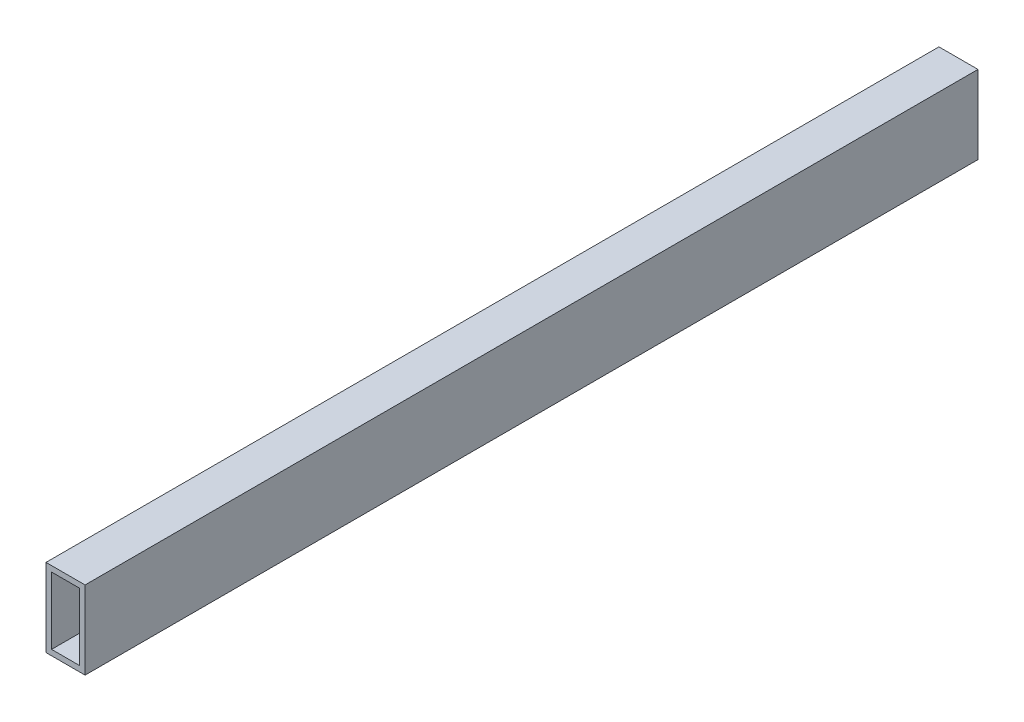
ISO-10303-21;
HEADER;
FILE_DESCRIPTION(('STEP AP214'),'2;1');
FILE_NAME('part.step','',(''),(''),'','','');
FILE_SCHEMA(('AUTOMOTIVE_DESIGN { 1 0 10303 214 1 1 1 1 }'));
ENDSEC;
DATA;
#1=APPLICATION_CONTEXT('core data for automotive mechanical design processes');
#2=APPLICATION_PROTOCOL_DEFINITION('international standard','automotive_design',2000,#1);
#3=PRODUCT_CONTEXT('',#1,'mechanical');
#4=PRODUCT('Part','Part','',(#3));
#5=PRODUCT_RELATED_PRODUCT_CATEGORY('part','',(#4));
#6=PRODUCT_DEFINITION_FORMATION('','',#4);
#7=PRODUCT_DEFINITION_CONTEXT('part definition',#1,'design');
#8=PRODUCT_DEFINITION('design','',#6,#7);
#9=PRODUCT_DEFINITION_SHAPE('','',#8);
#10=(LENGTH_UNIT() NAMED_UNIT(*) SI_UNIT(.MILLI.,.METRE.));
#11=(NAMED_UNIT(*) PLANE_ANGLE_UNIT() SI_UNIT($,.RADIAN.));
#12=(NAMED_UNIT(*) SI_UNIT($,.STERADIAN.) SOLID_ANGLE_UNIT());
#13=UNCERTAINTY_MEASURE_WITH_UNIT(LENGTH_MEASURE(1.E-05),#10,'distance_accuracy_value','');
#14=(GEOMETRIC_REPRESENTATION_CONTEXT(3) GLOBAL_UNCERTAINTY_ASSIGNED_CONTEXT((#13)) GLOBAL_UNIT_ASSIGNED_CONTEXT((#10,
#11,#12)) REPRESENTATION_CONTEXT('',''));
#15=CARTESIAN_POINT('',(0.,0.,0.));
#16=DIRECTION('',(0.,0.,1.));
#17=DIRECTION('',(1.,0.,0.));
#18=AXIS2_PLACEMENT_3D('',#15,#16,#17);
#19=CARTESIAN_POINT('',(0.,0.,160.));
#20=DIRECTION('',(0.,0.,1.));
#21=DIRECTION('',(1.,0.,0.));
#22=AXIS2_PLACEMENT_3D('',#19,#20,#21);
#23=PLANE('',#22);
#24=DIRECTION('',(0.,1.,0.));
#25=VECTOR('',#24,1.);
#26=CARTESIAN_POINT('',(0.,0.,160.));
#27=LINE('',#26,#25);
#28=CARTESIAN_POINT('',(0.,0.,160.));
#29=VERTEX_POINT('',#28);
#30=CARTESIAN_POINT('',(0.,14.,160.));
#31=VERTEX_POINT('',#30);
#32=EDGE_CURVE('E153',#29,#31,#27,.T.);
#33=ORIENTED_EDGE('',*,*,#32,.T.);
#34=DIRECTION('',(-1.,0.,0.));
#35=VECTOR('',#34,1.);
#36=CARTESIAN_POINT('',(0.,14.,160.));
#37=LINE('',#36,#35);
#38=CARTESIAN_POINT('',(-7.,14.,160.));
#39=VERTEX_POINT('',#38);
#40=EDGE_CURVE('E157',#31,#39,#37,.T.);
#41=ORIENTED_EDGE('',*,*,#40,.T.);
#42=DIRECTION('',(0.,-1.,0.));
#43=VECTOR('',#42,1.);
#44=CARTESIAN_POINT('',(-7.,14.,160.));
#45=LINE('',#44,#43);
#46=CARTESIAN_POINT('',(-7.,0.,160.));
#47=VERTEX_POINT('',#46);
#48=EDGE_CURVE('E161',#39,#47,#45,.T.);
#49=ORIENTED_EDGE('',*,*,#48,.T.);
#50=DIRECTION('',(1.,0.,0.));
#51=VECTOR('',#50,1.);
#52=CARTESIAN_POINT('',(0.,0.,160.));
#53=LINE('',#52,#51);
#54=EDGE_CURVE('E164',#47,#29,#53,.T.);
#55=ORIENTED_EDGE('',*,*,#54,.T.);
#56=EDGE_LOOP('',(#33,#41,#49,#55));
#57=FACE_BOUND('',#56,.T.);
#58=DIRECTION('',(-1.,0.,0.));
#59=VECTOR('',#58,1.);
#60=CARTESIAN_POINT('',(-6.,13.,160.));
#61=LINE('',#60,#59);
#62=CARTESIAN_POINT('',(-1.,13.,160.));
#63=VERTEX_POINT('',#62);
#64=CARTESIAN_POINT('',(-6.,13.,160.));
#65=VERTEX_POINT('',#64);
#66=EDGE_CURVE('E114',#63,#65,#61,.T.);
#67=ORIENTED_EDGE('',*,*,#66,.F.);
#68=DIRECTION('',(0.,1.,0.));
#69=VECTOR('',#68,1.);
#70=CARTESIAN_POINT('',(-1.,1.,160.));
#71=LINE('',#70,#69);
#72=CARTESIAN_POINT('',(-1.,1.,160.));
#73=VERTEX_POINT('',#72);
#74=EDGE_CURVE('E105',#73,#63,#71,.T.);
#75=ORIENTED_EDGE('',*,*,#74,.F.);
#76=DIRECTION('',(1.,0.,0.));
#77=VECTOR('',#76,1.);
#78=CARTESIAN_POINT('',(-6.,1.,160.));
#79=LINE('',#78,#77);
#80=CARTESIAN_POINT('',(-6.,1.,160.));
#81=VERTEX_POINT('',#80);
#82=EDGE_CURVE('E131',#81,#73,#79,.T.);
#83=ORIENTED_EDGE('',*,*,#82,.F.);
#84=DIRECTION('',(0.,-1.,0.));
#85=VECTOR('',#84,1.);
#86=CARTESIAN_POINT('',(-6.,1.,160.));
#87=LINE('',#86,#85);
#88=EDGE_CURVE('E127',#65,#81,#87,.T.);
#89=ORIENTED_EDGE('',*,*,#88,.F.);
#90=EDGE_LOOP('',(#67,#75,#83,#89));
#91=FACE_BOUND('',#90,.T.);
#92=ADVANCED_FACE('F39',(#57,#91),#23,.T.);
#93=CARTESIAN_POINT('',(0.,0.,0.));
#94=DIRECTION('',(0.,0.,1.));
#95=DIRECTION('',(1.,0.,0.));
#96=AXIS2_PLACEMENT_3D('',#93,#94,#95);
#97=PLANE('',#96);
#98=DIRECTION('',(0.,1.,0.));
#99=VECTOR('',#98,1.);
#100=CARTESIAN_POINT('',(0.,0.,0.));
#101=LINE('',#100,#99);
#102=CARTESIAN_POINT('',(0.,0.,0.));
#103=VERTEX_POINT('',#102);
#104=CARTESIAN_POINT('',(0.,14.,0.));
#105=VERTEX_POINT('',#104);
#106=EDGE_CURVE('E123',#103,#105,#101,.T.);
#107=ORIENTED_EDGE('',*,*,#106,.F.);
#108=DIRECTION('',(1.,0.,0.));
#109=VECTOR('',#108,1.);
#110=CARTESIAN_POINT('',(0.,0.,0.));
#111=LINE('',#110,#109);
#112=CARTESIAN_POINT('',(-7.,0.,0.));
#113=VERTEX_POINT('',#112);
#114=EDGE_CURVE('E158',#113,#103,#111,.T.);
#115=ORIENTED_EDGE('',*,*,#114,.F.);
#116=DIRECTION('',(0.,-1.,0.));
#117=VECTOR('',#116,1.);
#118=CARTESIAN_POINT('',(-7.,14.,0.));
#119=LINE('',#118,#117);
#120=CARTESIAN_POINT('',(-7.,14.,0.));
#121=VERTEX_POINT('',#120);
#122=EDGE_CURVE('E174',#121,#113,#119,.T.);
#123=ORIENTED_EDGE('',*,*,#122,.F.);
#124=DIRECTION('',(-1.,0.,0.));
#125=VECTOR('',#124,1.);
#126=CARTESIAN_POINT('',(0.,14.,0.));
#127=LINE('',#126,#125);
#128=EDGE_CURVE('E171',#105,#121,#127,.T.);
#129=ORIENTED_EDGE('',*,*,#128,.F.);
#130=EDGE_LOOP('',(#107,#115,#123,#129));
#131=FACE_BOUND('',#130,.T.);
#132=DIRECTION('',(0.,1.,0.));
#133=VECTOR('',#132,1.);
#134=CARTESIAN_POINT('',(-1.,1.,0.));
#135=LINE('',#134,#133);
#136=CARTESIAN_POINT('',(-1.,1.,0.));
#137=VERTEX_POINT('',#136);
#138=CARTESIAN_POINT('',(-1.,13.,0.));
#139=VERTEX_POINT('',#138);
#140=EDGE_CURVE('E63',#137,#139,#135,.T.);
#141=ORIENTED_EDGE('',*,*,#140,.T.);
#142=DIRECTION('',(-1.,0.,0.));
#143=VECTOR('',#142,1.);
#144=CARTESIAN_POINT('',(-6.,13.,0.));
#145=LINE('',#144,#143);
#146=CARTESIAN_POINT('',(-6.,13.,0.));
#147=VERTEX_POINT('',#146);
#148=EDGE_CURVE('E121',#139,#147,#145,.T.);
#149=ORIENTED_EDGE('',*,*,#148,.T.);
#150=DIRECTION('',(0.,-1.,0.));
#151=VECTOR('',#150,1.);
#152=CARTESIAN_POINT('',(-6.,1.,0.));
#153=LINE('',#152,#151);
#154=CARTESIAN_POINT('',(-6.,1.,0.));
#155=VERTEX_POINT('',#154);
#156=EDGE_CURVE('E140',#147,#155,#153,.T.);
#157=ORIENTED_EDGE('',*,*,#156,.T.);
#158=DIRECTION('',(1.,0.,0.));
#159=VECTOR('',#158,1.);
#160=CARTESIAN_POINT('',(-6.,1.,0.));
#161=LINE('',#160,#159);
#162=EDGE_CURVE('E115',#155,#137,#161,.T.);
#163=ORIENTED_EDGE('',*,*,#162,.T.);
#164=EDGE_LOOP('',(#141,#149,#157,#163));
#165=FACE_BOUND('',#164,.T.);
#166=ADVANCED_FACE('F197',(#131,#165),#97,.F.);
#167=CARTESIAN_POINT('',(0.,0.,160.));
#168=DIRECTION('',(-1.,0.,0.));
#169=DIRECTION('',(0.,0.,1.));
#170=AXIS2_PLACEMENT_3D('',#167,#168,#169);
#171=PLANE('',#170);
#172=ORIENTED_EDGE('',*,*,#106,.T.);
#173=DIRECTION('',(0.,0.,-1.));
#174=VECTOR('',#173,1.);
#175=CARTESIAN_POINT('',(0.,14.,160.));
#176=LINE('',#175,#174);
#177=EDGE_CURVE('E11',#31,#105,#176,.T.);
#178=ORIENTED_EDGE('',*,*,#177,.F.);
#179=ORIENTED_EDGE('',*,*,#32,.F.);
#180=DIRECTION('',(0.,0.,-1.));
#181=VECTOR('',#180,1.);
#182=CARTESIAN_POINT('',(0.,0.,160.));
#183=LINE('',#182,#181);
#184=EDGE_CURVE('E167',#29,#103,#183,.T.);
#185=ORIENTED_EDGE('',*,*,#184,.T.);
#186=EDGE_LOOP('',(#172,#178,#179,#185));
#187=FACE_BOUND('',#186,.T.);
#188=ADVANCED_FACE('F41',(#187),#171,.F.);
#189=CARTESIAN_POINT('',(0.,14.,160.));
#190=DIRECTION('',(0.,-1.,0.));
#191=DIRECTION('',(0.,0.,-1.));
#192=AXIS2_PLACEMENT_3D('',#189,#190,#191);
#193=PLANE('',#192);
#194=ORIENTED_EDGE('',*,*,#128,.T.);
#195=DIRECTION('',(0.,0.,-1.));
#196=VECTOR('',#195,1.);
#197=CARTESIAN_POINT('',(-7.,14.,160.));
#198=LINE('',#197,#196);
#199=EDGE_CURVE('E48',#39,#121,#198,.T.);
#200=ORIENTED_EDGE('',*,*,#199,.F.);
#201=ORIENTED_EDGE('',*,*,#40,.F.);
#202=ORIENTED_EDGE('',*,*,#177,.T.);
#203=EDGE_LOOP('',(#194,#200,#201,#202));
#204=FACE_BOUND('',#203,.T.);
#205=ADVANCED_FACE('F207',(#204),#193,.F.);
#206=CARTESIAN_POINT('',(-7.,14.,160.));
#207=DIRECTION('',(1.,0.,0.));
#208=DIRECTION('',(0.,1.,0.));
#209=AXIS2_PLACEMENT_3D('',#206,#207,#208);
#210=PLANE('',#209);
#211=ORIENTED_EDGE('',*,*,#122,.T.);
#212=DIRECTION('',(0.,0.,-1.));
#213=VECTOR('',#212,1.);
#214=CARTESIAN_POINT('',(-7.,0.,160.));
#215=LINE('',#214,#213);
#216=EDGE_CURVE('E182',#47,#113,#215,.T.);
#217=ORIENTED_EDGE('',*,*,#216,.F.);
#218=ORIENTED_EDGE('',*,*,#48,.F.);
#219=ORIENTED_EDGE('',*,*,#199,.T.);
#220=EDGE_LOOP('',(#211,#217,#218,#219));
#221=FACE_BOUND('',#220,.T.);
#222=ADVANCED_FACE('F191',(#221),#210,.F.);
#223=CARTESIAN_POINT('',(0.,0.,160.));
#224=DIRECTION('',(0.,1.,0.));
#225=DIRECTION('',(-1.,0.,0.));
#226=AXIS2_PLACEMENT_3D('',#223,#224,#225);
#227=PLANE('',#226);
#228=ORIENTED_EDGE('',*,*,#114,.T.);
#229=ORIENTED_EDGE('',*,*,#184,.F.);
#230=ORIENTED_EDGE('',*,*,#54,.F.);
#231=ORIENTED_EDGE('',*,*,#216,.T.);
#232=EDGE_LOOP('',(#228,#229,#230,#231));
#233=FACE_BOUND('',#232,.T.);
#234=ADVANCED_FACE('F201',(#233),#227,.F.);
#235=CARTESIAN_POINT('',(-1.,1.,160.));
#236=DIRECTION('',(-1.,0.,0.));
#237=DIRECTION('',(0.,0.,1.));
#238=AXIS2_PLACEMENT_3D('',#235,#236,#237);
#239=PLANE('',#238);
#240=ORIENTED_EDGE('',*,*,#140,.F.);
#241=DIRECTION('',(0.,0.,-1.));
#242=VECTOR('',#241,1.);
#243=CARTESIAN_POINT('',(-1.,1.,160.));
#244=LINE('',#243,#242);
#245=EDGE_CURVE('E109',#73,#137,#244,.T.);
#246=ORIENTED_EDGE('',*,*,#245,.F.);
#247=ORIENTED_EDGE('',*,*,#74,.T.);
#248=DIRECTION('',(0.,0.,-1.));
#249=VECTOR('',#248,1.);
#250=CARTESIAN_POINT('',(-1.,13.,160.));
#251=LINE('',#250,#249);
#252=EDGE_CURVE('E108',#63,#139,#251,.T.);
#253=ORIENTED_EDGE('',*,*,#252,.T.);
#254=EDGE_LOOP('',(#240,#246,#247,#253));
#255=FACE_BOUND('',#254,.T.);
#256=ADVANCED_FACE('F107',(#255),#239,.T.);
#257=CARTESIAN_POINT('',(-6.,13.,160.));
#258=DIRECTION('',(0.,-1.,0.));
#259=DIRECTION('',(0.,0.,-1.));
#260=AXIS2_PLACEMENT_3D('',#257,#258,#259);
#261=PLANE('',#260);
#262=ORIENTED_EDGE('',*,*,#148,.F.);
#263=ORIENTED_EDGE('',*,*,#252,.F.);
#264=ORIENTED_EDGE('',*,*,#66,.T.);
#265=DIRECTION('',(0.,0.,-1.));
#266=VECTOR('',#265,1.);
#267=CARTESIAN_POINT('',(-6.,13.,160.));
#268=LINE('',#267,#266);
#269=EDGE_CURVE('E124',#65,#147,#268,.T.);
#270=ORIENTED_EDGE('',*,*,#269,.T.);
#271=EDGE_LOOP('',(#262,#263,#264,#270));
#272=FACE_BOUND('',#271,.T.);
#273=ADVANCED_FACE('F118',(#272),#261,.T.);
#274=CARTESIAN_POINT('',(-6.,1.,160.));
#275=DIRECTION('',(1.,0.,0.));
#276=DIRECTION('',(0.,0.,-1.));
#277=AXIS2_PLACEMENT_3D('',#274,#275,#276);
#278=PLANE('',#277);
#279=ORIENTED_EDGE('',*,*,#156,.F.);
#280=ORIENTED_EDGE('',*,*,#269,.F.);
#281=ORIENTED_EDGE('',*,*,#88,.T.);
#282=DIRECTION('',(0.,0.,-1.));
#283=VECTOR('',#282,1.);
#284=CARTESIAN_POINT('',(-6.,1.,160.));
#285=LINE('',#284,#283);
#286=EDGE_CURVE('E55',#81,#155,#285,.T.);
#287=ORIENTED_EDGE('',*,*,#286,.T.);
#288=EDGE_LOOP('',(#279,#280,#281,#287));
#289=FACE_BOUND('',#288,.T.);
#290=ADVANCED_FACE('F230',(#289),#278,.T.);
#291=CARTESIAN_POINT('',(-6.,1.,160.));
#292=DIRECTION('',(0.,1.,0.));
#293=DIRECTION('',(0.,0.,1.));
#294=AXIS2_PLACEMENT_3D('',#291,#292,#293);
#295=PLANE('',#294);
#296=ORIENTED_EDGE('',*,*,#162,.F.);
#297=ORIENTED_EDGE('',*,*,#286,.F.);
#298=ORIENTED_EDGE('',*,*,#82,.T.);
#299=ORIENTED_EDGE('',*,*,#245,.T.);
#300=EDGE_LOOP('',(#296,#297,#298,#299));
#301=FACE_BOUND('',#300,.T.);
#302=ADVANCED_FACE('F234',(#301),#295,.T.);
#303=CLOSED_SHELL('',(#92,#166,#188,#205,#222,#234,#256,#273,#290,#302));
#304=MANIFOLD_SOLID_BREP('B2',#303);
#305=ADVANCED_BREP_SHAPE_REPRESENTATION('',(#18,#304),#14);
#306=SHAPE_DEFINITION_REPRESENTATION(#9,#305);
ENDSEC;
END-ISO-10303-21;
